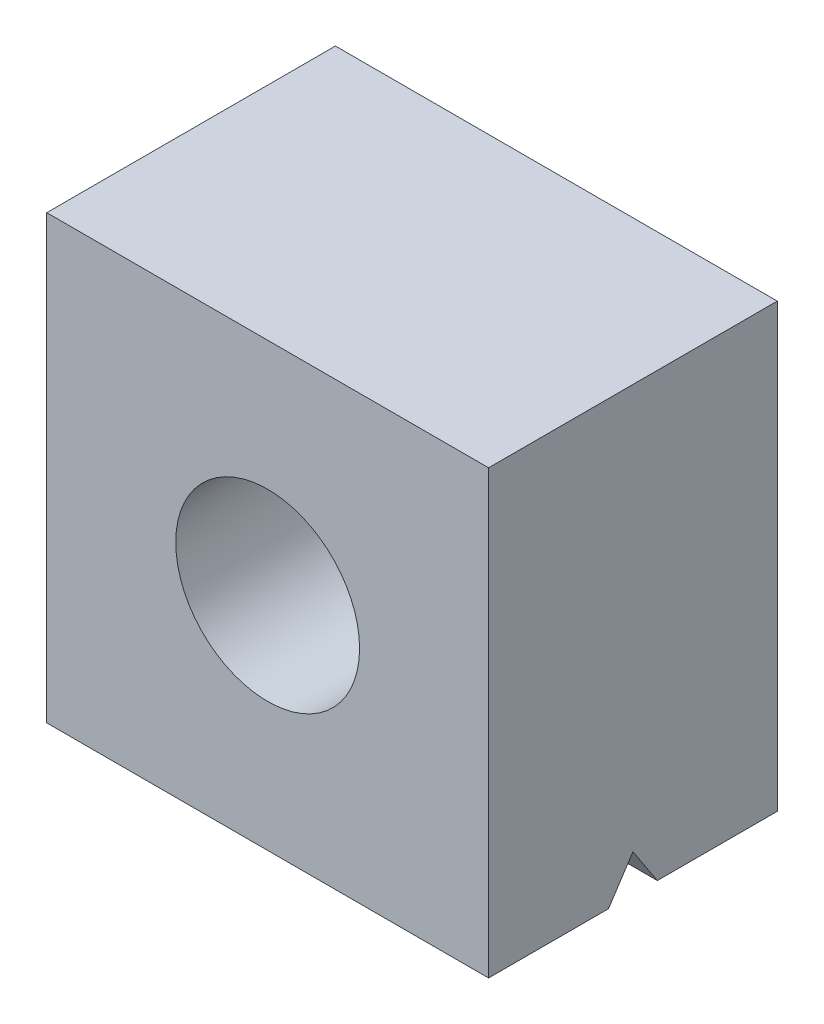
ISO-10303-21;
HEADER;
FILE_DESCRIPTION(('STEP AP214'),'2;1');
FILE_NAME('part.step','',(''),(''),'','','');
FILE_SCHEMA(('AUTOMOTIVE_DESIGN { 1 0 10303 214 1 1 1 1 }'));
ENDSEC;
DATA;
#1=APPLICATION_CONTEXT('core data for automotive mechanical design processes');
#2=APPLICATION_PROTOCOL_DEFINITION('international standard','automotive_design',2000,#1);
#3=PRODUCT_CONTEXT('',#1,'mechanical');
#4=PRODUCT('Part','Part','',(#3));
#5=PRODUCT_RELATED_PRODUCT_CATEGORY('part','',(#4));
#6=PRODUCT_DEFINITION_FORMATION('','',#4);
#7=PRODUCT_DEFINITION_CONTEXT('part definition',#1,'design');
#8=PRODUCT_DEFINITION('design','',#6,#7);
#9=PRODUCT_DEFINITION_SHAPE('','',#8);
#10=(LENGTH_UNIT() NAMED_UNIT(*) SI_UNIT(.MILLI.,.METRE.));
#11=(NAMED_UNIT(*) PLANE_ANGLE_UNIT() SI_UNIT($,.RADIAN.));
#12=(NAMED_UNIT(*) SI_UNIT($,.STERADIAN.) SOLID_ANGLE_UNIT());
#13=UNCERTAINTY_MEASURE_WITH_UNIT(LENGTH_MEASURE(1.E-05),#10,'distance_accuracy_value','');
#14=(GEOMETRIC_REPRESENTATION_CONTEXT(3) GLOBAL_UNCERTAINTY_ASSIGNED_CONTEXT((#13)) GLOBAL_UNIT_ASSIGNED_CONTEXT((#10,
#11,#12)) REPRESENTATION_CONTEXT('',''));
#15=CARTESIAN_POINT('',(0.,0.,0.));
#16=DIRECTION('',(0.,0.,1.));
#17=DIRECTION('',(1.,0.,0.));
#18=AXIS2_PLACEMENT_3D('',#15,#16,#17);
#19=CARTESIAN_POINT('',(-9.525,-9.525,12.446));
#20=DIRECTION('',(0.,1.,0.));
#21=DIRECTION('',(0.,0.,1.));
#22=AXIS2_PLACEMENT_3D('',#19,#20,#21);
#23=PLANE('',#22);
#24=DIRECTION('',(-1.,0.,0.));
#25=VECTOR('',#24,1.);
#26=CARTESIAN_POINT('',(49.0021543392933,-9.525,7.27583268087312));
#27=LINE('',#26,#25);
#28=CARTESIAN_POINT('',(9.525,-9.52500000000001,7.27583268087313));
#29=VERTEX_POINT('',#28);
#30=CARTESIAN_POINT('',(-9.525,-9.52500000000001,7.27583268087313));
#31=VERTEX_POINT('',#30);
#32=EDGE_CURVE('E176',#29,#31,#27,.T.);
#33=ORIENTED_EDGE('',*,*,#32,.F.);
#34=DIRECTION('',(0.,0.,-1.));
#35=VECTOR('',#34,1.);
#36=CARTESIAN_POINT('',(9.525,-9.525,12.446));
#37=LINE('',#36,#35);
#38=CARTESIAN_POINT('',(9.525,-9.525,12.446));
#39=VERTEX_POINT('',#38);
#40=EDGE_CURVE('E113',#39,#29,#37,.T.);
#41=ORIENTED_EDGE('',*,*,#40,.F.);
#42=DIRECTION('',(1.,0.,0.));
#43=VECTOR('',#42,1.);
#44=CARTESIAN_POINT('',(-9.525,-9.525,12.446));
#45=LINE('',#44,#43);
#46=CARTESIAN_POINT('',(-9.525,-9.525,12.446));
#47=VERTEX_POINT('',#46);
#48=EDGE_CURVE('E153',#47,#39,#45,.T.);
#49=ORIENTED_EDGE('',*,*,#48,.F.);
#50=DIRECTION('',(0.,0.,-1.));
#51=VECTOR('',#50,1.);
#52=CARTESIAN_POINT('',(-9.525,-9.525,12.446));
#53=LINE('',#52,#51);
#54=EDGE_CURVE('E112',#47,#31,#53,.T.);
#55=ORIENTED_EDGE('',*,*,#54,.T.);
#56=EDGE_LOOP('',(#33,#41,#49,#55));
#57=FACE_BOUND('',#56,.T.);
#58=ADVANCED_FACE('F43',(#57),#23,.F.);
#59=CARTESIAN_POINT('',(9.525,9.525,12.446));
#60=DIRECTION('',(-1.,0.,0.));
#61=DIRECTION('',(0.,-1.,0.));
#62=AXIS2_PLACEMENT_3D('',#59,#60,#61);
#63=PLANE('',#62);
#64=DIRECTION('',(0.,-0.835400416607128,0.54964183240783));
#65=VECTOR('',#64,1.);
#66=CARTESIAN_POINT('',(9.525,1.3958869784165,0.0905641425662518));
#67=LINE('',#66,#65);
#68=CARTESIAN_POINT('',(9.525,-7.9248,6.223));
#69=VERTEX_POINT('',#68);
#70=EDGE_CURVE('E59',#69,#29,#67,.T.);
#71=ORIENTED_EDGE('',*,*,#70,.F.);
#72=DIRECTION('',(0.,0.835400416607128,0.54964183240783));
#73=VECTOR('',#72,1.);
#74=CARTESIAN_POINT('',(9.525,7.11072944079205,16.1154489248193));
#75=LINE('',#74,#73);
#76=CARTESIAN_POINT('',(9.525,-9.52500000000001,5.17016731912687));
#77=VERTEX_POINT('',#76);
#78=EDGE_CURVE('E63',#77,#69,#75,.T.);
#79=ORIENTED_EDGE('',*,*,#78,.F.);
#80=CARTESIAN_POINT('',(9.525,-9.525,0.));
#81=VERTEX_POINT('',#80);
#82=EDGE_CURVE('E118',#77,#81,#37,.T.);
#83=ORIENTED_EDGE('',*,*,#82,.T.);
#84=DIRECTION('',(0.,1.,0.));
#85=VECTOR('',#84,1.);
#86=CARTESIAN_POINT('',(9.525,9.525,0.));
#87=LINE('',#86,#85);
#88=CARTESIAN_POINT('',(9.525,9.525,0.));
#89=VERTEX_POINT('',#88);
#90=EDGE_CURVE('E148',#81,#89,#87,.T.);
#91=ORIENTED_EDGE('',*,*,#90,.T.);
#92=DIRECTION('',(0.,0.,-1.));
#93=VECTOR('',#92,1.);
#94=CARTESIAN_POINT('',(9.525,9.525,12.446));
#95=LINE('',#94,#93);
#96=CARTESIAN_POINT('',(9.525,9.525,12.446));
#97=VERTEX_POINT('',#96);
#98=EDGE_CURVE('E127',#97,#89,#95,.T.);
#99=ORIENTED_EDGE('',*,*,#98,.F.);
#100=DIRECTION('',(0.,1.,0.));
#101=VECTOR('',#100,1.);
#102=CARTESIAN_POINT('',(9.525,9.525,12.446));
#103=LINE('',#102,#101);
#104=EDGE_CURVE('E142',#39,#97,#103,.T.);
#105=ORIENTED_EDGE('',*,*,#104,.F.);
#106=ORIENTED_EDGE('',*,*,#40,.T.);
#107=EDGE_LOOP('',(#71,#79,#83,#91,#99,#105,#106));
#108=FACE_BOUND('',#107,.T.);
#109=ADVANCED_FACE('F45',(#108),#63,.F.);
#110=CARTESIAN_POINT('',(-9.525,9.525,12.446));
#111=DIRECTION('',(1.,0.,0.));
#112=DIRECTION('',(0.,1.,0.));
#113=AXIS2_PLACEMENT_3D('',#110,#111,#112);
#114=PLANE('',#113);
#115=DIRECTION('',(0.,0.835400416607128,-0.54964183240783));
#116=VECTOR('',#115,1.);
#117=CARTESIAN_POINT('',(-9.525,1.3958869784165,0.0905641425662518));
#118=LINE('',#117,#116);
#119=CARTESIAN_POINT('',(-9.525,-7.9248,6.223));
#120=VERTEX_POINT('',#119);
#121=EDGE_CURVE('E11',#31,#120,#118,.T.);
#122=ORIENTED_EDGE('',*,*,#121,.F.);
#123=ORIENTED_EDGE('',*,*,#54,.F.);
#124=DIRECTION('',(0.,-1.,0.));
#125=VECTOR('',#124,1.);
#126=CARTESIAN_POINT('',(-9.525,9.525,12.446));
#127=LINE('',#126,#125);
#128=CARTESIAN_POINT('',(-9.525,9.525,12.446));
#129=VERTEX_POINT('',#128);
#130=EDGE_CURVE('E156',#129,#47,#127,.T.);
#131=ORIENTED_EDGE('',*,*,#130,.F.);
#132=DIRECTION('',(0.,0.,-1.));
#133=VECTOR('',#132,1.);
#134=CARTESIAN_POINT('',(-9.525,9.525,12.446));
#135=LINE('',#134,#133);
#136=CARTESIAN_POINT('',(-9.525,9.525,0.));
#137=VERTEX_POINT('',#136);
#138=EDGE_CURVE('E130',#129,#137,#135,.T.);
#139=ORIENTED_EDGE('',*,*,#138,.T.);
#140=DIRECTION('',(0.,-1.,0.));
#141=VECTOR('',#140,1.);
#142=CARTESIAN_POINT('',(-9.525,9.525,0.));
#143=LINE('',#142,#141);
#144=CARTESIAN_POINT('',(-9.525,-9.525,0.));
#145=VERTEX_POINT('',#144);
#146=EDGE_CURVE('E107',#137,#145,#143,.T.);
#147=ORIENTED_EDGE('',*,*,#146,.T.);
#148=CARTESIAN_POINT('',(-9.525,-9.525,5.17016731912687));
#149=VERTEX_POINT('',#148);
#150=EDGE_CURVE('E101',#149,#145,#53,.T.);
#151=ORIENTED_EDGE('',*,*,#150,.F.);
#152=DIRECTION('',(0.,-0.835400416607128,-0.54964183240783));
#153=VECTOR('',#152,1.);
#154=CARTESIAN_POINT('',(-9.525,7.11072944079205,16.1154489248193));
#155=LINE('',#154,#153);
#156=EDGE_CURVE('E52',#120,#149,#155,.T.);
#157=ORIENTED_EDGE('',*,*,#156,.F.);
#158=EDGE_LOOP('',(#122,#123,#131,#139,#147,#151,#157));
#159=FACE_BOUND('',#158,.T.);
#160=ADVANCED_FACE('F103',(#159),#114,.F.);
#161=CARTESIAN_POINT('',(-9.525,9.525,12.446));
#162=DIRECTION('',(0.,-1.,0.));
#163=DIRECTION('',(0.,0.,-1.));
#164=AXIS2_PLACEMENT_3D('',#161,#162,#163);
#165=PLANE('',#164);
#166=DIRECTION('',(-1.,0.,0.));
#167=VECTOR('',#166,1.);
#168=CARTESIAN_POINT('',(-9.525,9.525,0.));
#169=LINE('',#168,#167);
#170=EDGE_CURVE('E145',#89,#137,#169,.T.);
#171=ORIENTED_EDGE('',*,*,#170,.T.);
#172=ORIENTED_EDGE('',*,*,#138,.F.);
#173=DIRECTION('',(-1.,0.,0.));
#174=VECTOR('',#173,1.);
#175=CARTESIAN_POINT('',(-9.525,9.525,12.446));
#176=LINE('',#175,#174);
#177=EDGE_CURVE('E159',#97,#129,#176,.T.);
#178=ORIENTED_EDGE('',*,*,#177,.F.);
#179=ORIENTED_EDGE('',*,*,#98,.T.);
#180=EDGE_LOOP('',(#171,#172,#178,#179));
#181=FACE_BOUND('',#180,.T.);
#182=ADVANCED_FACE('F188',(#181),#165,.F.);
#183=ORIENTED_EDGE('',*,*,#82,.F.);
#184=DIRECTION('',(-1.,0.,0.));
#185=VECTOR('',#184,1.);
#186=CARTESIAN_POINT('',(49.0021543392933,-9.525,5.17016731912687));
#187=LINE('',#186,#185);
#188=EDGE_CURVE('E116',#77,#149,#187,.T.);
#189=ORIENTED_EDGE('',*,*,#188,.T.);
#190=ORIENTED_EDGE('',*,*,#150,.T.);
#191=DIRECTION('',(1.,0.,0.));
#192=VECTOR('',#191,1.);
#193=CARTESIAN_POINT('',(-9.525,-9.525,0.));
#194=LINE('',#193,#192);
#195=EDGE_CURVE('E139',#145,#81,#194,.T.);
#196=ORIENTED_EDGE('',*,*,#195,.T.);
#197=EDGE_LOOP('',(#183,#189,#190,#196));
#198=FACE_BOUND('',#197,.T.);
#199=ADVANCED_FACE('F117',(#198),#23,.F.);
#200=CARTESIAN_POINT('',(0.,0.,12.446));
#201=DIRECTION('',(0.,0.,1.));
#202=DIRECTION('',(1.,0.,0.));
#203=AXIS2_PLACEMENT_3D('',#200,#201,#202);
#204=PLANE('',#203);
#205=CARTESIAN_POINT('',(0.,0.,12.446));
#206=DIRECTION('',(0.,0.,1.));
#207=DIRECTION('',(1.,0.,0.));
#208=AXIS2_PLACEMENT_3D('',#205,#206,#207);
#209=CIRCLE('',#208,3.9624);
#210=CARTESIAN_POINT('',(3.9624,0.,12.446));
#211=VERTEX_POINT('',#210);
#212=EDGE_CURVE('E165',#211,#211,#209,.T.);
#213=ORIENTED_EDGE('',*,*,#212,.F.);
#214=EDGE_LOOP('',(#213));
#215=FACE_BOUND('',#214,.T.);
#216=ORIENTED_EDGE('',*,*,#104,.T.);
#217=ORIENTED_EDGE('',*,*,#177,.T.);
#218=ORIENTED_EDGE('',*,*,#130,.T.);
#219=ORIENTED_EDGE('',*,*,#48,.T.);
#220=EDGE_LOOP('',(#216,#217,#218,#219));
#221=FACE_BOUND('',#220,.T.);
#222=ADVANCED_FACE('F192',(#215,#221),#204,.T.);
#223=CARTESIAN_POINT('',(0.,0.,0.));
#224=DIRECTION('',(0.,0.,1.));
#225=DIRECTION('',(1.,0.,0.));
#226=AXIS2_PLACEMENT_3D('',#223,#224,#225);
#227=PLANE('',#226);
#228=CARTESIAN_POINT('',(0.,0.,0.));
#229=DIRECTION('',(0.,0.,1.));
#230=DIRECTION('',(1.,0.,0.));
#231=AXIS2_PLACEMENT_3D('',#228,#229,#230);
#232=CIRCLE('',#231,3.9624);
#233=CARTESIAN_POINT('',(3.9624,0.,0.));
#234=VERTEX_POINT('',#233);
#235=EDGE_CURVE('E152',#234,#234,#232,.T.);
#236=ORIENTED_EDGE('',*,*,#235,.T.);
#237=EDGE_LOOP('',(#236));
#238=FACE_BOUND('',#237,.T.);
#239=ORIENTED_EDGE('',*,*,#90,.F.);
#240=ORIENTED_EDGE('',*,*,#195,.F.);
#241=ORIENTED_EDGE('',*,*,#146,.F.);
#242=ORIENTED_EDGE('',*,*,#170,.F.);
#243=EDGE_LOOP('',(#239,#240,#241,#242));
#244=FACE_BOUND('',#243,.T.);
#245=ADVANCED_FACE('F185',(#238,#244),#227,.F.);
#246=CARTESIAN_POINT('',(0.,0.,0.));
#247=DIRECTION('',(0.,0.,1.));
#248=DIRECTION('',(1.,0.,0.));
#249=AXIS2_PLACEMENT_3D('',#246,#247,#248);
#250=CYLINDRICAL_SURFACE('',#249,3.9624);
#251=ORIENTED_EDGE('',*,*,#235,.F.);
#252=EDGE_LOOP('',(#251));
#253=FACE_BOUND('',#252,.T.);
#254=ORIENTED_EDGE('',*,*,#212,.T.);
#255=EDGE_LOOP('',(#254));
#256=FACE_BOUND('',#255,.T.);
#257=ADVANCED_FACE('F200',(#253,#256),#250,.F.);
#258=CARTESIAN_POINT('',(49.0021543392933,-9.525,7.27583268087312));
#259=DIRECTION('',(0.,-0.549641832407829,-0.835400416607128));
#260=DIRECTION('',(0.,0.835400416607128,-0.54964183240783));
#261=AXIS2_PLACEMENT_3D('',#258,#259,#260);
#262=PLANE('',#261);
#263=DIRECTION('',(-1.,0.,0.));
#264=VECTOR('',#263,1.);
#265=CARTESIAN_POINT('',(49.0021543392933,-7.9248,6.223));
#266=LINE('',#265,#264);
#267=EDGE_CURVE('E121',#69,#120,#266,.T.);
#268=ORIENTED_EDGE('',*,*,#267,.F.);
#269=ORIENTED_EDGE('',*,*,#70,.T.);
#270=ORIENTED_EDGE('',*,*,#32,.T.);
#271=ORIENTED_EDGE('',*,*,#121,.T.);
#272=EDGE_LOOP('',(#268,#269,#270,#271));
#273=FACE_BOUND('',#272,.T.);
#274=ADVANCED_FACE('F198',(#273),#262,.T.);
#275=CARTESIAN_POINT('',(49.0021543392933,-9.525,5.17016731912687));
#276=DIRECTION('',(0.,-0.549641832407829,0.835400416607128));
#277=DIRECTION('',(0.,-0.835400416607128,-0.54964183240783));
#278=AXIS2_PLACEMENT_3D('',#275,#276,#277);
#279=PLANE('',#278);
#280=ORIENTED_EDGE('',*,*,#188,.F.);
#281=ORIENTED_EDGE('',*,*,#78,.T.);
#282=ORIENTED_EDGE('',*,*,#267,.T.);
#283=ORIENTED_EDGE('',*,*,#156,.T.);
#284=EDGE_LOOP('',(#280,#281,#282,#283));
#285=FACE_BOUND('',#284,.T.);
#286=ADVANCED_FACE('F124',(#285),#279,.T.);
#287=CLOSED_SHELL('',(#58,#109,#160,#182,#199,#222,#245,#257,#274,#286));
#288=MANIFOLD_SOLID_BREP('B2',#287);
#289=ADVANCED_BREP_SHAPE_REPRESENTATION('',(#18,#288),#14);
#290=SHAPE_DEFINITION_REPRESENTATION(#9,#289);
ENDSEC;
END-ISO-10303-21;
